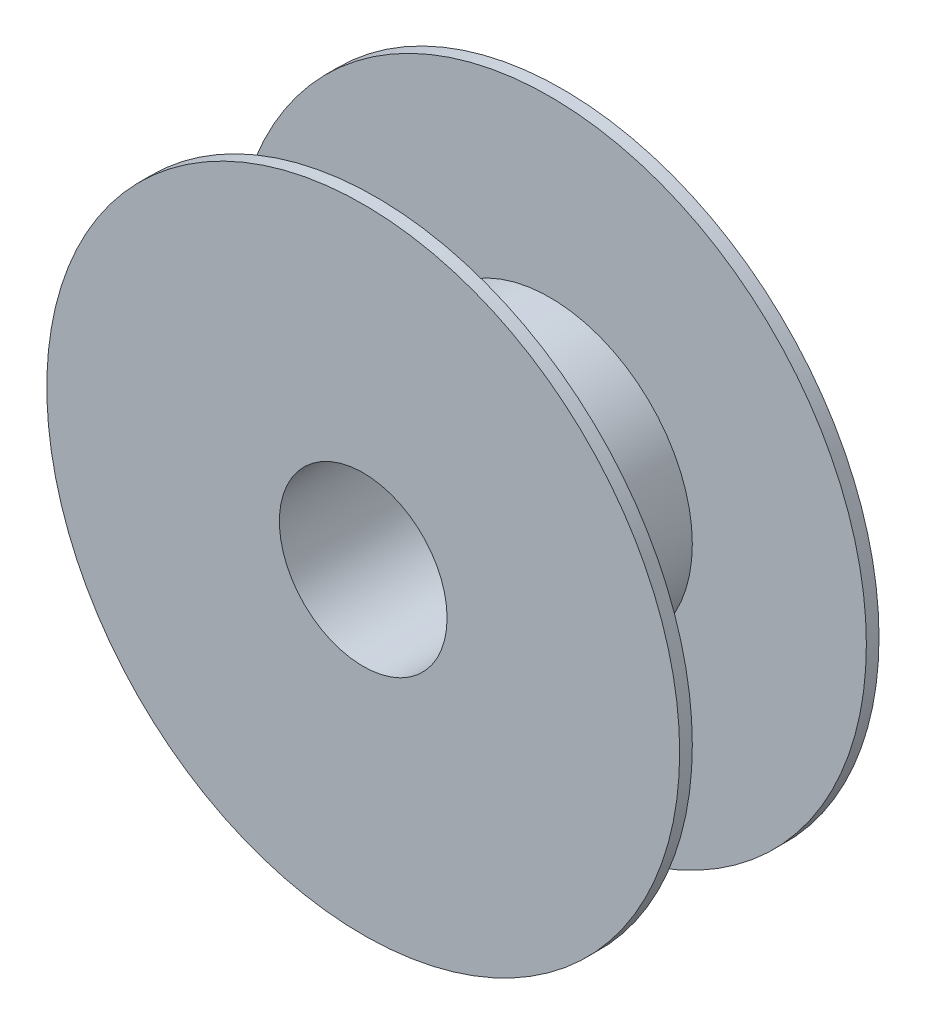
ISO-10303-21;
HEADER;
FILE_DESCRIPTION(('STEP AP214'),'2;1');
FILE_NAME('part.step','',(''),(''),'','','');
FILE_SCHEMA(('AUTOMOTIVE_DESIGN { 1 0 10303 214 1 1 1 1 }'));
ENDSEC;
DATA;
#1=APPLICATION_CONTEXT('core data for automotive mechanical design processes');
#2=APPLICATION_PROTOCOL_DEFINITION('international standard','automotive_design',2000,#1);
#3=PRODUCT_CONTEXT('',#1,'mechanical');
#4=PRODUCT('Part','Part','',(#3));
#5=PRODUCT_RELATED_PRODUCT_CATEGORY('part','',(#4));
#6=PRODUCT_DEFINITION_FORMATION('','',#4);
#7=PRODUCT_DEFINITION_CONTEXT('part definition',#1,'design');
#8=PRODUCT_DEFINITION('design','',#6,#7);
#9=PRODUCT_DEFINITION_SHAPE('','',#8);
#10=(LENGTH_UNIT() NAMED_UNIT(*) SI_UNIT(.MILLI.,.METRE.));
#11=(NAMED_UNIT(*) PLANE_ANGLE_UNIT() SI_UNIT($,.RADIAN.));
#12=(NAMED_UNIT(*) SI_UNIT($,.STERADIAN.) SOLID_ANGLE_UNIT());
#13=UNCERTAINTY_MEASURE_WITH_UNIT(LENGTH_MEASURE(1.E-05),#10,'distance_accuracy_value','');
#14=(GEOMETRIC_REPRESENTATION_CONTEXT(3) GLOBAL_UNCERTAINTY_ASSIGNED_CONTEXT((#13)) GLOBAL_UNIT_ASSIGNED_CONTEXT((#10,
#11,#12)) REPRESENTATION_CONTEXT('',''));
#15=CARTESIAN_POINT('',(0.,0.,0.));
#16=DIRECTION('',(0.,0.,1.));
#17=DIRECTION('',(1.,0.,0.));
#18=AXIS2_PLACEMENT_3D('',#15,#16,#17);
#19=CARTESIAN_POINT('',(0.,0.,31.5));
#20=DIRECTION('',(0.,0.,-1.));
#21=DIRECTION('',(-1.,0.,0.));
#22=AXIS2_PLACEMENT_3D('',#19,#20,#21);
#23=CYLINDRICAL_SURFACE('',#22,100.);
#24=CARTESIAN_POINT('',(0.,0.,-31.5));
#25=DIRECTION('',(0.,0.,1.));
#26=DIRECTION('',(1.,0.,0.));
#27=AXIS2_PLACEMENT_3D('',#24,#25,#26);
#28=CIRCLE('',#27,100.);
#29=CARTESIAN_POINT('',(100.,0.,-31.5));
#30=VERTEX_POINT('',#29);
#31=EDGE_CURVE('E34',#30,#30,#28,.T.);
#32=ORIENTED_EDGE('',*,*,#31,.T.);
#33=EDGE_LOOP('',(#32));
#34=FACE_BOUND('',#33,.T.);
#35=CARTESIAN_POINT('',(0.,0.,-27.5));
#36=DIRECTION('',(0.,0.,1.));
#37=DIRECTION('',(1.,0.,0.));
#38=AXIS2_PLACEMENT_3D('',#35,#36,#37);
#39=CIRCLE('',#38,100.);
#40=CARTESIAN_POINT('',(100.,0.,-27.5));
#41=VERTEX_POINT('',#40);
#42=EDGE_CURVE('E46',#41,#41,#39,.T.);
#43=ORIENTED_EDGE('',*,*,#42,.F.);
#44=EDGE_LOOP('',(#43));
#45=FACE_BOUND('',#44,.T.);
#46=ADVANCED_FACE('F30',(#34,#45),#23,.T.);
#47=CARTESIAN_POINT('',(0.,0.,31.5));
#48=DIRECTION('',(0.,0.,1.));
#49=DIRECTION('',(1.,0.,0.));
#50=AXIS2_PLACEMENT_3D('',#47,#48,#49);
#51=PLANE('',#50);
#52=CARTESIAN_POINT('',(0.,0.,31.5));
#53=DIRECTION('',(0.,0.,1.));
#54=DIRECTION('',(1.,0.,0.));
#55=AXIS2_PLACEMENT_3D('',#52,#53,#54);
#56=CIRCLE('',#55,100.);
#57=CARTESIAN_POINT('',(100.,0.,31.5));
#58=VERTEX_POINT('',#57);
#59=EDGE_CURVE('E10',#58,#58,#56,.T.);
#60=ORIENTED_EDGE('',*,*,#59,.T.);
#61=EDGE_LOOP('',(#60));
#62=FACE_BOUND('',#61,.T.);
#63=CARTESIAN_POINT('',(0.,0.,31.5));
#64=DIRECTION('',(0.,0.,1.));
#65=DIRECTION('',(1.,0.,0.));
#66=AXIS2_PLACEMENT_3D('',#63,#64,#65);
#67=CIRCLE('',#66,26.5);
#68=CARTESIAN_POINT('',(26.5,0.,31.5));
#69=VERTEX_POINT('',#68);
#70=EDGE_CURVE('E41',#69,#69,#67,.T.);
#71=ORIENTED_EDGE('',*,*,#70,.F.);
#72=EDGE_LOOP('',(#71));
#73=FACE_BOUND('',#72,.T.);
#74=ADVANCED_FACE('F73',(#62,#73),#51,.T.);
#75=CARTESIAN_POINT('',(0.,0.,-31.5));
#76=DIRECTION('',(0.,0.,1.));
#77=DIRECTION('',(1.,0.,0.));
#78=AXIS2_PLACEMENT_3D('',#75,#76,#77);
#79=PLANE('',#78);
#80=ORIENTED_EDGE('',*,*,#31,.F.);
#81=EDGE_LOOP('',(#80));
#82=FACE_BOUND('',#81,.T.);
#83=CARTESIAN_POINT('',(0.,0.,-31.5));
#84=DIRECTION('',(0.,0.,1.));
#85=DIRECTION('',(1.,0.,0.));
#86=AXIS2_PLACEMENT_3D('',#83,#84,#85);
#87=CIRCLE('',#86,26.5);
#88=CARTESIAN_POINT('',(26.5,0.,-31.5));
#89=VERTEX_POINT('',#88);
#90=EDGE_CURVE('E43',#89,#89,#87,.T.);
#91=ORIENTED_EDGE('',*,*,#90,.T.);
#92=EDGE_LOOP('',(#91));
#93=FACE_BOUND('',#92,.T.);
#94=ADVANCED_FACE('F78',(#82,#93),#79,.F.);
#95=CARTESIAN_POINT('',(0.,0.,27.5));
#96=DIRECTION('',(0.,0.,1.));
#97=DIRECTION('',(1.,0.,0.));
#98=AXIS2_PLACEMENT_3D('',#95,#96,#97);
#99=CIRCLE('',#98,100.);
#100=CARTESIAN_POINT('',(100.,0.,27.5));
#101=VERTEX_POINT('',#100);
#102=EDGE_CURVE('E49',#101,#101,#99,.T.);
#103=ORIENTED_EDGE('',*,*,#102,.T.);
#104=EDGE_LOOP('',(#103));
#105=FACE_BOUND('',#104,.T.);
#106=ORIENTED_EDGE('',*,*,#59,.F.);
#107=EDGE_LOOP('',(#106));
#108=FACE_BOUND('',#107,.T.);
#109=ADVANCED_FACE('F32',(#105,#108),#23,.T.);
#110=CARTESIAN_POINT('',(0.,0.,31.5));
#111=DIRECTION('',(0.,0.,-1.));
#112=DIRECTION('',(-1.,0.,0.));
#113=AXIS2_PLACEMENT_3D('',#110,#111,#112);
#114=CYLINDRICAL_SURFACE('',#113,26.5);
#115=ORIENTED_EDGE('',*,*,#70,.T.);
#116=EDGE_LOOP('',(#115));
#117=FACE_BOUND('',#116,.T.);
#118=ORIENTED_EDGE('',*,*,#90,.F.);
#119=EDGE_LOOP('',(#118));
#120=FACE_BOUND('',#119,.T.);
#121=ADVANCED_FACE('F68',(#117,#120),#114,.F.);
#122=CARTESIAN_POINT('',(0.,0.,-27.5));
#123=DIRECTION('',(0.,0.,1.));
#124=DIRECTION('',(1.,0.,0.));
#125=AXIS2_PLACEMENT_3D('',#122,#123,#124);
#126=PLANE('',#125);
#127=CARTESIAN_POINT('',(0.,0.,-27.5));
#128=DIRECTION('',(0.,0.,1.));
#129=DIRECTION('',(1.,0.,0.));
#130=AXIS2_PLACEMENT_3D('',#127,#128,#129);
#131=CIRCLE('',#130,45.);
#132=CARTESIAN_POINT('',(45.,0.,-27.5));
#133=VERTEX_POINT('',#132);
#134=EDGE_CURVE('E52',#133,#133,#131,.T.);
#135=ORIENTED_EDGE('',*,*,#134,.F.);
#136=EDGE_LOOP('',(#135));
#137=FACE_BOUND('',#136,.T.);
#138=ORIENTED_EDGE('',*,*,#42,.T.);
#139=EDGE_LOOP('',(#138));
#140=FACE_BOUND('',#139,.T.);
#141=ADVANCED_FACE('F64',(#137,#140),#126,.T.);
#142=CARTESIAN_POINT('',(0.,0.,27.5));
#143=DIRECTION('',(0.,0.,1.));
#144=DIRECTION('',(1.,0.,0.));
#145=AXIS2_PLACEMENT_3D('',#142,#143,#144);
#146=PLANE('',#145);
#147=CARTESIAN_POINT('',(0.,0.,27.5));
#148=DIRECTION('',(0.,0.,1.));
#149=DIRECTION('',(1.,0.,0.));
#150=AXIS2_PLACEMENT_3D('',#147,#148,#149);
#151=CIRCLE('',#150,45.);
#152=CARTESIAN_POINT('',(45.,0.,27.5));
#153=VERTEX_POINT('',#152);
#154=EDGE_CURVE('E55',#153,#153,#151,.T.);
#155=ORIENTED_EDGE('',*,*,#154,.T.);
#156=EDGE_LOOP('',(#155));
#157=FACE_BOUND('',#156,.T.);
#158=ORIENTED_EDGE('',*,*,#102,.F.);
#159=EDGE_LOOP('',(#158));
#160=FACE_BOUND('',#159,.T.);
#161=ADVANCED_FACE('F67',(#157,#160),#146,.F.);
#162=CARTESIAN_POINT('',(0.,0.,-27.5));
#163=DIRECTION('',(0.,0.,1.));
#164=DIRECTION('',(1.,0.,0.));
#165=AXIS2_PLACEMENT_3D('',#162,#163,#164);
#166=CYLINDRICAL_SURFACE('',#165,45.);
#167=ORIENTED_EDGE('',*,*,#134,.T.);
#168=EDGE_LOOP('',(#167));
#169=FACE_BOUND('',#168,.T.);
#170=ORIENTED_EDGE('',*,*,#154,.F.);
#171=EDGE_LOOP('',(#170));
#172=FACE_BOUND('',#171,.T.);
#173=ADVANCED_FACE('F61',(#169,#172),#166,.T.);
#174=CLOSED_SHELL('',(#46,#74,#94,#109,#121,#141,#161,#173));
#175=MANIFOLD_SOLID_BREP('B2',#174);
#176=ADVANCED_BREP_SHAPE_REPRESENTATION('',(#18,#175),#14);
#177=SHAPE_DEFINITION_REPRESENTATION(#9,#176);
ENDSEC;
END-ISO-10303-21;
